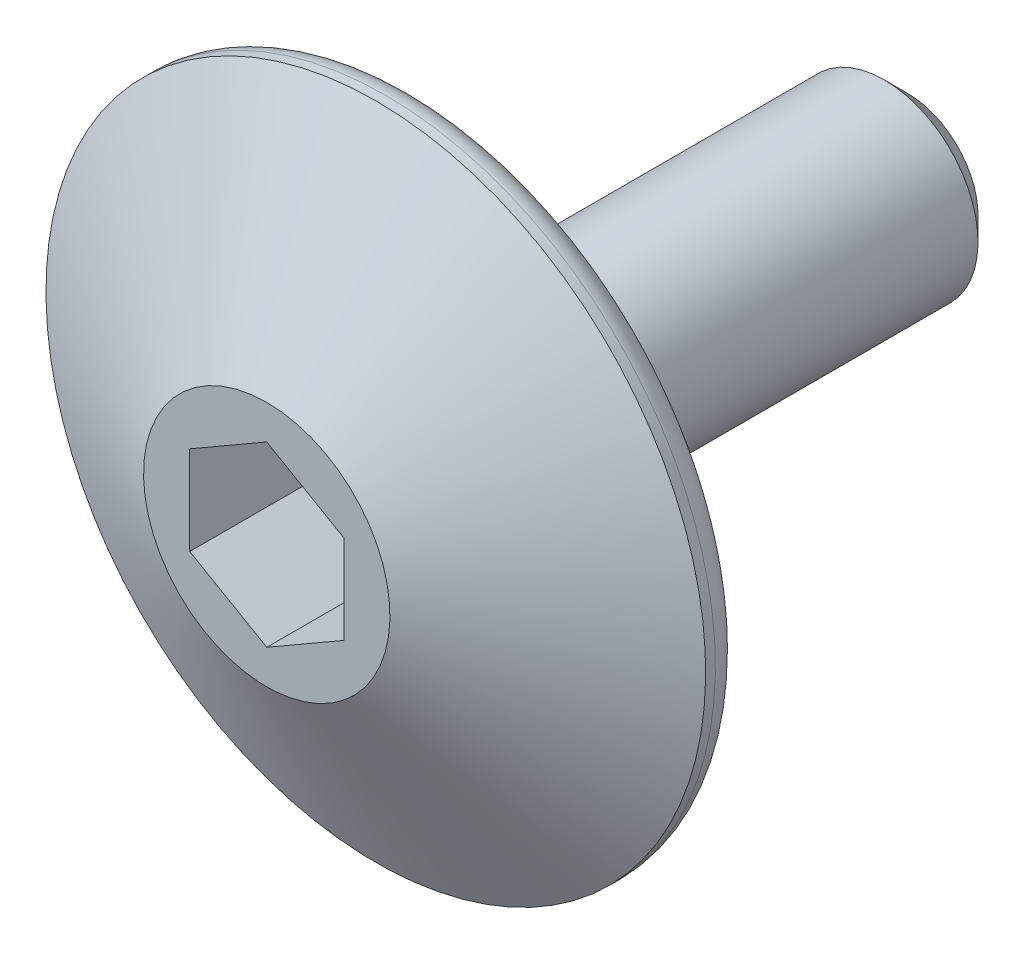
ISO-10303-21;
HEADER;
FILE_DESCRIPTION(('STEP AP214'),'2;1');
FILE_NAME('part.step','',(''),(''),'','','');
FILE_SCHEMA(('AUTOMOTIVE_DESIGN { 1 0 10303 214 1 1 1 1 }'));
ENDSEC;
DATA;
#1=APPLICATION_CONTEXT('core data for automotive mechanical design processes');
#2=APPLICATION_PROTOCOL_DEFINITION('international standard','automotive_design',2000,#1);
#3=PRODUCT_CONTEXT('',#1,'mechanical');
#4=PRODUCT('Part','Part','',(#3));
#5=PRODUCT_RELATED_PRODUCT_CATEGORY('part','',(#4));
#6=PRODUCT_DEFINITION_FORMATION('','',#4);
#7=PRODUCT_DEFINITION_CONTEXT('part definition',#1,'design');
#8=PRODUCT_DEFINITION('design','',#6,#7);
#9=PRODUCT_DEFINITION_SHAPE('','',#8);
#10=(LENGTH_UNIT() NAMED_UNIT(*) SI_UNIT(.MILLI.,.METRE.));
#11=(NAMED_UNIT(*) PLANE_ANGLE_UNIT() SI_UNIT($,.RADIAN.));
#12=(NAMED_UNIT(*) SI_UNIT($,.STERADIAN.) SOLID_ANGLE_UNIT());
#13=UNCERTAINTY_MEASURE_WITH_UNIT(LENGTH_MEASURE(1.E-05),#10,'distance_accuracy_value','');
#14=(GEOMETRIC_REPRESENTATION_CONTEXT(3) GLOBAL_UNCERTAINTY_ASSIGNED_CONTEXT((#13)) GLOBAL_UNIT_ASSIGNED_CONTEXT((#10,
#11,#12)) REPRESENTATION_CONTEXT('',''));
#15=CARTESIAN_POINT('',(0.,0.,0.));
#16=DIRECTION('',(0.,0.,1.));
#17=DIRECTION('',(1.,0.,0.));
#18=AXIS2_PLACEMENT_3D('',#15,#16,#17);
#19=CARTESIAN_POINT('',(0.,0.,0.750000024));
#20=DIRECTION('',(0.,0.,-1.));
#21=DIRECTION('',(0.,1.,0.));
#22=AXIS2_PLACEMENT_3D('',#19,#20,#21);
#23=TOROIDAL_SURFACE('',#22,7.749999994,0.750000024);
#24=CARTESIAN_POINT('',(0.,0.,0.750000024));
#25=DIRECTION('',(0.,0.,-1.));
#26=DIRECTION('',(0.,1.,0.));
#27=AXIS2_PLACEMENT_3D('',#24,#25,#26);
#28=CIRCLE('',#27,8.500000018);
#29=CARTESIAN_POINT('',(0.,8.500000018,0.750000024));
#30=VERTEX_POINT('',#29);
#31=EDGE_CURVE('E144',#30,#30,#28,.F.);
#32=ORIENTED_EDGE('',*,*,#31,.F.);
#33=EDGE_LOOP('',(#32));
#34=FACE_BOUND('',#33,.T.);
#35=CARTESIAN_POINT('',(0.,0.,0.0238156233482086));
#36=DIRECTION('',(0.,0.,1.));
#37=DIRECTION('',(1.,0.,0.));
#38=AXIS2_PLACEMENT_3D('',#35,#36,#37);
#39=CIRCLE('',#38,7.9375);
#40=CARTESIAN_POINT('',(7.9375,0.,0.0238156233482086));
#41=VERTEX_POINT('',#40);
#42=EDGE_CURVE('E148',#41,#41,#39,.F.);
#43=ORIENTED_EDGE('',*,*,#42,.F.);
#44=EDGE_LOOP('',(#43));
#45=FACE_BOUND('',#44,.T.);
#46=ADVANCED_FACE('F17',(#34,#45),#23,.T.);
#47=CARTESIAN_POINT('',(-1.5875,0.,3.81));
#48=DIRECTION('',(0.,0.,1.));
#49=DIRECTION('',(0.,-1.,0.));
#50=AXIS2_PLACEMENT_3D('',#47,#48,#49);
#51=PLANE('',#50);
#52=DIRECTION('',(0.,-1.,0.));
#53=VECTOR('',#52,1.);
#54=CARTESIAN_POINT('',(-1.984375,0.,3.81));
#55=LINE('',#54,#53);
#56=CARTESIAN_POINT('',(-1.984375,1.14567944042316,3.81));
#57=VERTEX_POINT('',#56);
#58=CARTESIAN_POINT('',(-1.984375,-1.14567944042316,3.81));
#59=VERTEX_POINT('',#58);
#60=EDGE_CURVE('E83',#57,#59,#55,.T.);
#61=ORIENTED_EDGE('',*,*,#60,.F.);
#62=DIRECTION('',(-0.866025403784439,-0.5,0.));
#63=VECTOR('',#62,1.);
#64=CARTESIAN_POINT('',(-0.9921875,1.71851916063474,3.81));
#65=LINE('',#64,#63);
#66=CARTESIAN_POINT('',(0.,2.29135888084632,3.81));
#67=VERTEX_POINT('',#66);
#68=EDGE_CURVE('E110',#67,#57,#65,.T.);
#69=ORIENTED_EDGE('',*,*,#68,.F.);
#70=DIRECTION('',(-0.866025403784439,0.5,0.));
#71=VECTOR('',#70,1.);
#72=CARTESIAN_POINT('',(0.9921875,1.71851916063474,3.81));
#73=LINE('',#72,#71);
#74=CARTESIAN_POINT('',(1.984375,1.14567944042316,3.81));
#75=VERTEX_POINT('',#74);
#76=EDGE_CURVE('E106',#75,#67,#73,.T.);
#77=ORIENTED_EDGE('',*,*,#76,.F.);
#78=DIRECTION('',(0.,1.,0.));
#79=VECTOR('',#78,1.);
#80=CARTESIAN_POINT('',(1.984375,0.,3.81));
#81=LINE('',#80,#79);
#82=CARTESIAN_POINT('',(1.984375,-1.14567944042316,3.81));
#83=VERTEX_POINT('',#82);
#84=EDGE_CURVE('E100',#83,#75,#81,.T.);
#85=ORIENTED_EDGE('',*,*,#84,.F.);
#86=DIRECTION('',(0.866025403784439,0.5,0.));
#87=VECTOR('',#86,1.);
#88=CARTESIAN_POINT('',(0.9921875,-1.71851916063474,3.81));
#89=LINE('',#88,#87);
#90=CARTESIAN_POINT('',(0.,-2.29135888084632,3.81));
#91=VERTEX_POINT('',#90);
#92=EDGE_CURVE('E93',#91,#83,#89,.T.);
#93=ORIENTED_EDGE('',*,*,#92,.F.);
#94=DIRECTION('',(0.866025403784439,-0.5,0.));
#95=VECTOR('',#94,1.);
#96=CARTESIAN_POINT('',(-0.9921875,-1.71851916063474,3.81));
#97=LINE('',#96,#95);
#98=EDGE_CURVE('E74',#59,#91,#97,.T.);
#99=ORIENTED_EDGE('',*,*,#98,.F.);
#100=EDGE_LOOP('',(#61,#69,#77,#85,#93,#99));
#101=FACE_BOUND('',#100,.T.);
#102=CARTESIAN_POINT('',(0.,0.,3.81));
#103=DIRECTION('',(0.,0.,-1.));
#104=DIRECTION('',(0.,1.,0.));
#105=AXIS2_PLACEMENT_3D('',#102,#103,#104);
#106=CIRCLE('',#105,3.175);
#107=CARTESIAN_POINT('',(0.,3.175,3.81));
#108=VERTEX_POINT('',#107);
#109=EDGE_CURVE('E133',#108,#108,#106,.T.);
#110=ORIENTED_EDGE('',*,*,#109,.F.);
#111=EDGE_LOOP('',(#110));
#112=FACE_BOUND('',#111,.T.);
#113=ADVANCED_FACE('F89',(#101,#112),#51,.T.);
#114=CARTESIAN_POINT('',(0.,0.,1.000000032));
#115=DIRECTION('',(0.,0.,-1.));
#116=DIRECTION('',(0.,1.,0.));
#117=AXIS2_PLACEMENT_3D('',#114,#115,#116);
#118=CONICAL_SURFACE('',#117,8.500000018,1.08523544160049);
#119=ORIENTED_EDGE('',*,*,#109,.T.);
#120=EDGE_LOOP('',(#119));
#121=FACE_BOUND('',#120,.T.);
#122=CARTESIAN_POINT('',(0.,0.,1.000000032));
#123=DIRECTION('',(0.,0.,-1.));
#124=DIRECTION('',(0.,1.,0.));
#125=AXIS2_PLACEMENT_3D('',#122,#123,#124);
#126=CIRCLE('',#125,8.500000018);
#127=CARTESIAN_POINT('',(0.,8.500000018,1.000000032));
#128=VERTEX_POINT('',#127);
#129=EDGE_CURVE('E129',#128,#128,#126,.T.);
#130=ORIENTED_EDGE('',*,*,#129,.F.);
#131=EDGE_LOOP('',(#130));
#132=FACE_BOUND('',#131,.T.);
#133=ADVANCED_FACE('F195',(#121,#132),#118,.T.);
#134=CARTESIAN_POINT('',(0.,0.,-4.445));
#135=DIRECTION('',(0.,0.,-1.));
#136=DIRECTION('',(0.,1.,0.));
#137=AXIS2_PLACEMENT_3D('',#134,#135,#136);
#138=CYLINDRICAL_SURFACE('',#137,8.500000018);
#139=ORIENTED_EDGE('',*,*,#31,.T.);
#140=EDGE_LOOP('',(#139));
#141=FACE_BOUND('',#140,.T.);
#142=ORIENTED_EDGE('',*,*,#129,.T.);
#143=EDGE_LOOP('',(#142));
#144=FACE_BOUND('',#143,.T.);
#145=ADVANCED_FACE('F227',(#141,#144),#138,.T.);
#146=CARTESIAN_POINT('',(-1.984375,0.,0.));
#147=DIRECTION('',(-1.,0.,0.));
#148=DIRECTION('',(0.,-1.,0.));
#149=AXIS2_PLACEMENT_3D('',#146,#147,#148);
#150=PLANE('',#149);
#151=DIRECTION('',(0.,-1.,0.));
#152=VECTOR('',#151,1.);
#153=CARTESIAN_POINT('',(-1.984375,0.,0.64135));
#154=LINE('',#153,#152);
#155=CARTESIAN_POINT('',(-1.984375,1.14567944042316,0.64135));
#156=VERTEX_POINT('',#155);
#157=CARTESIAN_POINT('',(-1.984375,-1.14567944042316,0.64135));
#158=VERTEX_POINT('',#157);
#159=EDGE_CURVE('E26',#156,#158,#154,.T.);
#160=ORIENTED_EDGE('',*,*,#159,.F.);
#161=DIRECTION('',(0.,0.,1.));
#162=VECTOR('',#161,1.);
#163=CARTESIAN_POINT('',(-1.984375,1.14567944042316,0.));
#164=LINE('',#163,#162);
#165=EDGE_CURVE('E33',#156,#57,#164,.T.);
#166=ORIENTED_EDGE('',*,*,#165,.T.);
#167=ORIENTED_EDGE('',*,*,#60,.T.);
#168=DIRECTION('',(0.,0.,1.));
#169=VECTOR('',#168,1.);
#170=CARTESIAN_POINT('',(-1.984375,-1.14567944042316,0.));
#171=LINE('',#170,#169);
#172=EDGE_CURVE('E70',#158,#59,#171,.T.);
#173=ORIENTED_EDGE('',*,*,#172,.F.);
#174=EDGE_LOOP('',(#160,#166,#167,#173));
#175=FACE_BOUND('',#174,.T.);
#176=ADVANCED_FACE('F84',(#175),#150,.F.);
#177=CARTESIAN_POINT('',(-0.9921875,-1.71851916063474,0.));
#178=DIRECTION('',(-0.5,-0.866025403784438,0.));
#179=DIRECTION('',(0.866025403784439,-0.5,0.));
#180=AXIS2_PLACEMENT_3D('',#177,#178,#179);
#181=PLANE('',#180);
#182=DIRECTION('',(0.866025403784439,-0.5,0.));
#183=VECTOR('',#182,1.);
#184=CARTESIAN_POINT('',(-0.9921875,-1.71851916063474,0.64135));
#185=LINE('',#184,#183);
#186=CARTESIAN_POINT('',(0.,-2.29135888084632,0.64135));
#187=VERTEX_POINT('',#186);
#188=EDGE_CURVE('E41',#158,#187,#185,.T.);
#189=ORIENTED_EDGE('',*,*,#188,.F.);
#190=ORIENTED_EDGE('',*,*,#172,.T.);
#191=ORIENTED_EDGE('',*,*,#98,.T.);
#192=DIRECTION('',(0.,0.,1.));
#193=VECTOR('',#192,1.);
#194=CARTESIAN_POINT('',(0.,-2.29135888084632,0.));
#195=LINE('',#194,#193);
#196=EDGE_CURVE('E80',#187,#91,#195,.T.);
#197=ORIENTED_EDGE('',*,*,#196,.F.);
#198=EDGE_LOOP('',(#189,#190,#191,#197));
#199=FACE_BOUND('',#198,.T.);
#200=ADVANCED_FACE('F72',(#199),#181,.F.);
#201=CARTESIAN_POINT('',(0.9921875,-1.71851916063474,0.));
#202=DIRECTION('',(0.5,-0.866025403784439,0.));
#203=DIRECTION('',(0.866025403784439,0.5,0.));
#204=AXIS2_PLACEMENT_3D('',#201,#202,#203);
#205=PLANE('',#204);
#206=DIRECTION('',(0.866025403784439,0.5,0.));
#207=VECTOR('',#206,1.);
#208=CARTESIAN_POINT('',(0.9921875,-1.71851916063474,0.64135));
#209=LINE('',#208,#207);
#210=CARTESIAN_POINT('',(1.984375,-1.14567944042316,0.64135));
#211=VERTEX_POINT('',#210);
#212=EDGE_CURVE('E163',#187,#211,#209,.T.);
#213=ORIENTED_EDGE('',*,*,#212,.F.);
#214=ORIENTED_EDGE('',*,*,#196,.T.);
#215=ORIENTED_EDGE('',*,*,#92,.T.);
#216=DIRECTION('',(0.,0.,1.));
#217=VECTOR('',#216,1.);
#218=CARTESIAN_POINT('',(1.984375,-1.14567944042316,0.));
#219=LINE('',#218,#217);
#220=EDGE_CURVE('E121',#211,#83,#219,.T.);
#221=ORIENTED_EDGE('',*,*,#220,.F.);
#222=EDGE_LOOP('',(#213,#214,#215,#221));
#223=FACE_BOUND('',#222,.T.);
#224=ADVANCED_FACE('F181',(#223),#205,.F.);
#225=CARTESIAN_POINT('',(1.984375,0.,0.));
#226=DIRECTION('',(1.,0.,0.));
#227=DIRECTION('',(0.,1.,0.));
#228=AXIS2_PLACEMENT_3D('',#225,#226,#227);
#229=PLANE('',#228);
#230=DIRECTION('',(0.,1.,0.));
#231=VECTOR('',#230,1.);
#232=CARTESIAN_POINT('',(1.984375,0.,0.64135));
#233=LINE('',#232,#231);
#234=CARTESIAN_POINT('',(1.984375,1.14567944042316,0.64135));
#235=VERTEX_POINT('',#234);
#236=EDGE_CURVE('E159',#211,#235,#233,.T.);
#237=ORIENTED_EDGE('',*,*,#236,.F.);
#238=ORIENTED_EDGE('',*,*,#220,.T.);
#239=ORIENTED_EDGE('',*,*,#84,.T.);
#240=DIRECTION('',(0.,0.,1.));
#241=VECTOR('',#240,1.);
#242=CARTESIAN_POINT('',(1.984375,1.14567944042316,0.));
#243=LINE('',#242,#241);
#244=EDGE_CURVE('E118',#235,#75,#243,.T.);
#245=ORIENTED_EDGE('',*,*,#244,.F.);
#246=EDGE_LOOP('',(#237,#238,#239,#245));
#247=FACE_BOUND('',#246,.T.);
#248=ADVANCED_FACE('F178',(#247),#229,.F.);
#249=CARTESIAN_POINT('',(0.9921875,1.71851916063474,0.));
#250=DIRECTION('',(0.5,0.866025403784439,0.));
#251=DIRECTION('',(-0.866025403784439,0.5,0.));
#252=AXIS2_PLACEMENT_3D('',#249,#250,#251);
#253=PLANE('',#252);
#254=DIRECTION('',(-0.866025403784439,0.5,0.));
#255=VECTOR('',#254,1.);
#256=CARTESIAN_POINT('',(0.9921875,1.71851916063474,0.64135));
#257=LINE('',#256,#255);
#258=CARTESIAN_POINT('',(0.,2.29135888084632,0.64135));
#259=VERTEX_POINT('',#258);
#260=EDGE_CURVE('E156',#235,#259,#257,.T.);
#261=ORIENTED_EDGE('',*,*,#260,.F.);
#262=ORIENTED_EDGE('',*,*,#244,.T.);
#263=ORIENTED_EDGE('',*,*,#76,.T.);
#264=DIRECTION('',(0.,0.,1.));
#265=VECTOR('',#264,1.);
#266=CARTESIAN_POINT('',(0.,2.29135888084632,0.));
#267=LINE('',#266,#265);
#268=EDGE_CURVE('E115',#259,#67,#267,.T.);
#269=ORIENTED_EDGE('',*,*,#268,.F.);
#270=EDGE_LOOP('',(#261,#262,#263,#269));
#271=FACE_BOUND('',#270,.T.);
#272=ADVANCED_FACE('F174',(#271),#253,.F.);
#273=CARTESIAN_POINT('',(-0.9921875,1.71851916063474,0.));
#274=DIRECTION('',(-0.5,0.866025403784439,0.));
#275=DIRECTION('',(-0.866025403784439,-0.5,0.));
#276=AXIS2_PLACEMENT_3D('',#273,#274,#275);
#277=PLANE('',#276);
#278=DIRECTION('',(-0.866025403784439,-0.5,0.));
#279=VECTOR('',#278,1.);
#280=CARTESIAN_POINT('',(-0.9921875,1.71851916063474,0.64135));
#281=LINE('',#280,#279);
#282=EDGE_CURVE('E152',#259,#156,#281,.T.);
#283=ORIENTED_EDGE('',*,*,#282,.F.);
#284=ORIENTED_EDGE('',*,*,#268,.T.);
#285=ORIENTED_EDGE('',*,*,#68,.T.);
#286=ORIENTED_EDGE('',*,*,#165,.F.);
#287=EDGE_LOOP('',(#283,#284,#285,#286));
#288=FACE_BOUND('',#287,.T.);
#289=ADVANCED_FACE('F172',(#288),#277,.F.);
#290=CARTESIAN_POINT('',(0.,0.,0.64135));
#291=DIRECTION('',(0.,0.,-1.));
#292=DIRECTION('',(-1.,0.,0.));
#293=AXIS2_PLACEMENT_3D('',#290,#291,#292);
#294=CYLINDRICAL_SURFACE('',#293,7.9375);
#295=ORIENTED_EDGE('',*,*,#42,.T.);
#296=EDGE_LOOP('',(#295));
#297=FACE_BOUND('',#296,.T.);
#298=CARTESIAN_POINT('',(0.,0.,0.));
#299=DIRECTION('',(0.,0.,1.));
#300=DIRECTION('',(1.,0.,0.));
#301=AXIS2_PLACEMENT_3D('',#298,#299,#300);
#302=CIRCLE('',#301,7.9375);
#303=CARTESIAN_POINT('',(7.9375,0.,0.));
#304=VERTEX_POINT('',#303);
#305=EDGE_CURVE('E11',#304,#304,#302,.T.);
#306=ORIENTED_EDGE('',*,*,#305,.T.);
#307=EDGE_LOOP('',(#306));
#308=FACE_BOUND('',#307,.T.);
#309=ADVANCED_FACE('F19',(#297,#308),#294,.T.);
#310=CARTESIAN_POINT('',(0.,0.,0.));
#311=DIRECTION('',(0.,0.,1.));
#312=DIRECTION('',(1.,0.,0.));
#313=AXIS2_PLACEMENT_3D('',#310,#311,#312);
#314=PLANE('',#313);
#315=ORIENTED_EDGE('',*,*,#305,.F.);
#316=EDGE_LOOP('',(#315));
#317=FACE_BOUND('',#316,.T.);
#318=CARTESIAN_POINT('',(0.,0.,0.));
#319=DIRECTION('',(0.,0.,-1.));
#320=DIRECTION('',(0.,1.,0.));
#321=AXIS2_PLACEMENT_3D('',#318,#319,#320);
#322=CIRCLE('',#321,2.413);
#323=CARTESIAN_POINT('',(0.,2.413,0.));
#324=VERTEX_POINT('',#323);
#325=EDGE_CURVE('E79',#324,#324,#322,.T.);
#326=ORIENTED_EDGE('',*,*,#325,.F.);
#327=EDGE_LOOP('',(#326));
#328=FACE_BOUND('',#327,.T.);
#329=ADVANCED_FACE('F206',(#317,#328),#314,.F.);
#330=CARTESIAN_POINT('',(-1.2065,0.,-12.7));
#331=DIRECTION('',(0.,0.,-1.));
#332=DIRECTION('',(0.,1.,0.));
#333=AXIS2_PLACEMENT_3D('',#330,#331,#332);
#334=PLANE('',#333);
#335=CARTESIAN_POINT('',(0.,0.,-12.7));
#336=DIRECTION('',(0.,0.,-1.));
#337=DIRECTION('',(0.,1.,0.));
#338=AXIS2_PLACEMENT_3D('',#335,#336,#337);
#339=CIRCLE('',#338,1.81768750000001);
#340=CARTESIAN_POINT('',(0.,1.81768750000001,-12.7));
#341=VERTEX_POINT('',#340);
#342=EDGE_CURVE('E137',#341,#341,#339,.T.);
#343=ORIENTED_EDGE('',*,*,#342,.T.);
#344=EDGE_LOOP('',(#343));
#345=FACE_BOUND('',#344,.T.);
#346=ADVANCED_FACE('F208',(#345),#334,.T.);
#347=CARTESIAN_POINT('',(0.,0.,-12.7));
#348=DIRECTION('',(0.,0.,1.));
#349=DIRECTION('',(0.,-1.,0.));
#350=AXIS2_PLACEMENT_3D('',#347,#348,#349);
#351=CONICAL_SURFACE('',#350,1.81768750000001,0.785398163397446);
#352=CARTESIAN_POINT('',(0.,0.,-12.1046875));
#353=DIRECTION('',(0.,0.,-1.));
#354=DIRECTION('',(0.,1.,0.));
#355=AXIS2_PLACEMENT_3D('',#352,#353,#354);
#356=CIRCLE('',#355,2.413);
#357=CARTESIAN_POINT('',(0.,2.413,-12.1046875));
#358=VERTEX_POINT('',#357);
#359=EDGE_CURVE('E141',#358,#358,#356,.F.);
#360=ORIENTED_EDGE('',*,*,#359,.F.);
#361=EDGE_LOOP('',(#360));
#362=FACE_BOUND('',#361,.T.);
#363=ORIENTED_EDGE('',*,*,#342,.F.);
#364=EDGE_LOOP('',(#363));
#365=FACE_BOUND('',#364,.T.);
#366=ADVANCED_FACE('F202',(#362,#365),#351,.T.);
#367=CARTESIAN_POINT('',(0.,0.,-4.445));
#368=DIRECTION('',(0.,0.,-1.));
#369=DIRECTION('',(0.,1.,0.));
#370=AXIS2_PLACEMENT_3D('',#367,#368,#369);
#371=CYLINDRICAL_SURFACE('',#370,2.413);
#372=ORIENTED_EDGE('',*,*,#359,.T.);
#373=EDGE_LOOP('',(#372));
#374=FACE_BOUND('',#373,.T.);
#375=ORIENTED_EDGE('',*,*,#325,.T.);
#376=EDGE_LOOP('',(#375));
#377=FACE_BOUND('',#376,.T.);
#378=ADVANCED_FACE('F205',(#374,#377),#371,.T.);
#379=CARTESIAN_POINT('',(0.,0.,0.64135));
#380=DIRECTION('',(0.,0.,1.));
#381=DIRECTION('',(1.,0.,0.));
#382=AXIS2_PLACEMENT_3D('',#379,#380,#381);
#383=PLANE('',#382);
#384=ORIENTED_EDGE('',*,*,#282,.T.);
#385=ORIENTED_EDGE('',*,*,#159,.T.);
#386=ORIENTED_EDGE('',*,*,#188,.T.);
#387=ORIENTED_EDGE('',*,*,#212,.T.);
#388=ORIENTED_EDGE('',*,*,#236,.T.);
#389=ORIENTED_EDGE('',*,*,#260,.T.);
#390=EDGE_LOOP('',(#384,#385,#386,#387,#388,#389));
#391=FACE_BOUND('',#390,.T.);
#392=ADVANCED_FACE('F170',(#391),#383,.T.);
#393=CLOSED_SHELL('',(#46,#113,#133,#145,#176,#200,#224,#248,#272,#289,#309,#329,#346,#366,#378,#392));
#394=MANIFOLD_SOLID_BREP('B1',#393);
#395=ADVANCED_BREP_SHAPE_REPRESENTATION('',(#18,#394),#14);
#396=SHAPE_DEFINITION_REPRESENTATION(#9,#395);
ENDSEC;
END-ISO-10303-21;
